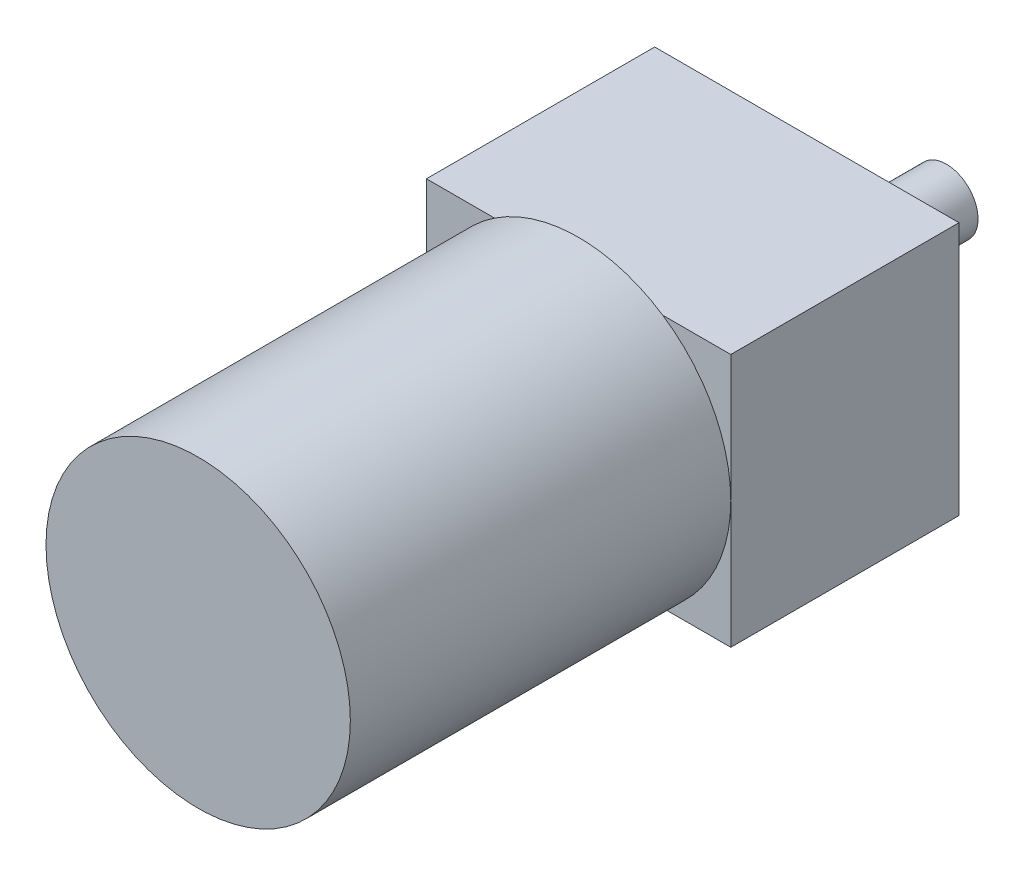
ISO-10303-21;
HEADER;
FILE_DESCRIPTION(('STEP AP214'),'2;1');
FILE_NAME('part.step','',(''),(''),'','','');
FILE_SCHEMA(('AUTOMOTIVE_DESIGN { 1 0 10303 214 1 1 1 1 }'));
ENDSEC;
DATA;
#1=APPLICATION_CONTEXT('core data for automotive mechanical design processes');
#2=APPLICATION_PROTOCOL_DEFINITION('international standard','automotive_design',2000,#1);
#3=PRODUCT_CONTEXT('',#1,'mechanical');
#4=PRODUCT('Part','Part','',(#3));
#5=PRODUCT_RELATED_PRODUCT_CATEGORY('part','',(#4));
#6=PRODUCT_DEFINITION_FORMATION('','',#4);
#7=PRODUCT_DEFINITION_CONTEXT('part definition',#1,'design');
#8=PRODUCT_DEFINITION('design','',#6,#7);
#9=PRODUCT_DEFINITION_SHAPE('','',#8);
#10=(LENGTH_UNIT() NAMED_UNIT(*) SI_UNIT(.MILLI.,.METRE.));
#11=(NAMED_UNIT(*) PLANE_ANGLE_UNIT() SI_UNIT($,.RADIAN.));
#12=(NAMED_UNIT(*) SI_UNIT($,.STERADIAN.) SOLID_ANGLE_UNIT());
#13=UNCERTAINTY_MEASURE_WITH_UNIT(LENGTH_MEASURE(1.E-05),#10,'distance_accuracy_value','');
#14=(GEOMETRIC_REPRESENTATION_CONTEXT(3) GLOBAL_UNCERTAINTY_ASSIGNED_CONTEXT((#13)) GLOBAL_UNIT_ASSIGNED_CONTEXT((#10,
#11,#12)) REPRESENTATION_CONTEXT('',''));
#15=CARTESIAN_POINT('',(0.,0.,0.));
#16=DIRECTION('',(0.,0.,1.));
#17=DIRECTION('',(1.,0.,0.));
#18=AXIS2_PLACEMENT_3D('',#15,#16,#17);
#19=CARTESIAN_POINT('',(0.,0.,9.));
#20=DIRECTION('',(0.,0.,1.));
#21=DIRECTION('',(1.,0.,0.));
#22=AXIS2_PLACEMENT_3D('',#19,#20,#21);
#23=PLANE('',#22);
#24=CARTESIAN_POINT('',(6.,-5.,9.));
#25=DIRECTION('',(0.,0.,1.));
#26=DIRECTION('',(1.,0.,0.));
#27=AXIS2_PLACEMENT_3D('',#24,#25,#26);
#28=CIRCLE('',#27,6.);
#29=CARTESIAN_POINT('',(2.6833752096446,0.,9.));
#30=VERTEX_POINT('',#29);
#31=CARTESIAN_POINT('',(0.,-5.,9.));
#32=VERTEX_POINT('',#31);
#33=EDGE_CURVE('E63',#30,#32,#28,.T.);
#34=ORIENTED_EDGE('',*,*,#33,.F.);
#35=DIRECTION('',(-1.,0.,0.));
#36=VECTOR('',#35,1.);
#37=CARTESIAN_POINT('',(0.,0.,9.));
#38=LINE('',#37,#36);
#39=CARTESIAN_POINT('',(0.,0.,9.));
#40=VERTEX_POINT('',#39);
#41=EDGE_CURVE('E119',#30,#40,#38,.T.);
#42=ORIENTED_EDGE('',*,*,#41,.T.);
#43=DIRECTION('',(0.,-1.,0.));
#44=VECTOR('',#43,1.);
#45=CARTESIAN_POINT('',(0.,0.,9.));
#46=LINE('',#45,#44);
#47=EDGE_CURVE('E155',#40,#32,#46,.T.);
#48=ORIENTED_EDGE('',*,*,#47,.T.);
#49=EDGE_LOOP('',(#34,#42,#48));
#50=FACE_BOUND('',#49,.T.);
#51=ADVANCED_FACE('F45',(#50),#23,.T.);
#52=CARTESIAN_POINT('',(2.6833752096446,-10.,9.));
#53=VERTEX_POINT('',#52);
#54=EDGE_CURVE('E147',#32,#53,#28,.T.);
#55=ORIENTED_EDGE('',*,*,#54,.F.);
#56=CARTESIAN_POINT('',(0.,-10.,9.));
#57=VERTEX_POINT('',#56);
#58=EDGE_CURVE('E158',#32,#57,#46,.T.);
#59=ORIENTED_EDGE('',*,*,#58,.T.);
#60=DIRECTION('',(1.,0.,0.));
#61=VECTOR('',#60,1.);
#62=CARTESIAN_POINT('',(0.,-10.,9.));
#63=LINE('',#62,#61);
#64=EDGE_CURVE('E129',#57,#53,#63,.T.);
#65=ORIENTED_EDGE('',*,*,#64,.T.);
#66=EDGE_LOOP('',(#55,#59,#65));
#67=FACE_BOUND('',#66,.T.);
#68=ADVANCED_FACE('F232',(#67),#23,.T.);
#69=CARTESIAN_POINT('',(12.,-5.,9.));
#70=VERTEX_POINT('',#69);
#71=CARTESIAN_POINT('',(9.3166247903554,0.,9.));
#72=VERTEX_POINT('',#71);
#73=EDGE_CURVE('E131',#70,#72,#28,.T.);
#74=ORIENTED_EDGE('',*,*,#73,.F.);
#75=DIRECTION('',(0.,1.,0.));
#76=VECTOR('',#75,1.);
#77=CARTESIAN_POINT('',(12.,0.,9.));
#78=LINE('',#77,#76);
#79=CARTESIAN_POINT('',(12.,0.,9.));
#80=VERTEX_POINT('',#79);
#81=EDGE_CURVE('E120',#70,#80,#78,.T.);
#82=ORIENTED_EDGE('',*,*,#81,.T.);
#83=EDGE_CURVE('E133',#80,#72,#38,.T.);
#84=ORIENTED_EDGE('',*,*,#83,.T.);
#85=EDGE_LOOP('',(#74,#82,#84));
#86=FACE_BOUND('',#85,.T.);
#87=ADVANCED_FACE('F132',(#86),#23,.T.);
#88=CARTESIAN_POINT('',(0.,0.,9.));
#89=DIRECTION('',(1.,0.,0.));
#90=DIRECTION('',(0.,1.,0.));
#91=AXIS2_PLACEMENT_3D('',#88,#89,#90);
#92=PLANE('',#91);
#93=DIRECTION('',(0.,-1.,0.));
#94=VECTOR('',#93,1.);
#95=CARTESIAN_POINT('',(0.,0.,0.));
#96=LINE('',#95,#94);
#97=CARTESIAN_POINT('',(0.,0.,0.));
#98=VERTEX_POINT('',#97);
#99=CARTESIAN_POINT('',(0.,-10.,0.));
#100=VERTEX_POINT('',#99);
#101=EDGE_CURVE('E166',#98,#100,#96,.T.);
#102=ORIENTED_EDGE('',*,*,#101,.T.);
#103=DIRECTION('',(0.,0.,-1.));
#104=VECTOR('',#103,1.);
#105=CARTESIAN_POINT('',(0.,-10.,9.));
#106=LINE('',#105,#104);
#107=EDGE_CURVE('E49',#57,#100,#106,.T.);
#108=ORIENTED_EDGE('',*,*,#107,.F.);
#109=ORIENTED_EDGE('',*,*,#58,.F.);
#110=ORIENTED_EDGE('',*,*,#47,.F.);
#111=DIRECTION('',(0.,0.,-1.));
#112=VECTOR('',#111,1.);
#113=CARTESIAN_POINT('',(0.,0.,9.));
#114=LINE('',#113,#112);
#115=EDGE_CURVE('E165',#40,#98,#114,.T.);
#116=ORIENTED_EDGE('',*,*,#115,.T.);
#117=EDGE_LOOP('',(#102,#108,#109,#110,#116));
#118=FACE_BOUND('',#117,.T.);
#119=ADVANCED_FACE('F47',(#118),#92,.F.);
#120=CARTESIAN_POINT('',(0.,-10.,9.));
#121=DIRECTION('',(0.,1.,0.));
#122=DIRECTION('',(0.,0.,1.));
#123=AXIS2_PLACEMENT_3D('',#120,#121,#122);
#124=PLANE('',#123);
#125=DIRECTION('',(1.,0.,0.));
#126=VECTOR('',#125,1.);
#127=CARTESIAN_POINT('',(0.,-10.,0.));
#128=LINE('',#127,#126);
#129=CARTESIAN_POINT('',(12.,-10.,0.));
#130=VERTEX_POINT('',#129);
#131=EDGE_CURVE('E170',#100,#130,#128,.T.);
#132=ORIENTED_EDGE('',*,*,#131,.T.);
#133=DIRECTION('',(0.,0.,-1.));
#134=VECTOR('',#133,1.);
#135=CARTESIAN_POINT('',(12.,-10.,9.));
#136=LINE('',#135,#134);
#137=CARTESIAN_POINT('',(12.,-10.,9.));
#138=VERTEX_POINT('',#137);
#139=EDGE_CURVE('E151',#138,#130,#136,.T.);
#140=ORIENTED_EDGE('',*,*,#139,.F.);
#141=CARTESIAN_POINT('',(9.3166247903554,-10.,9.));
#142=VERTEX_POINT('',#141);
#143=EDGE_CURVE('E114',#142,#138,#63,.T.);
#144=ORIENTED_EDGE('',*,*,#143,.F.);
#145=EDGE_CURVE('E161',#53,#142,#63,.T.);
#146=ORIENTED_EDGE('',*,*,#145,.F.);
#147=ORIENTED_EDGE('',*,*,#64,.F.);
#148=ORIENTED_EDGE('',*,*,#107,.T.);
#149=EDGE_LOOP('',(#132,#140,#144,#146,#147,#148));
#150=FACE_BOUND('',#149,.T.);
#151=ADVANCED_FACE('F253',(#150),#124,.F.);
#152=CARTESIAN_POINT('',(12.,0.,9.));
#153=DIRECTION('',(-1.,0.,0.));
#154=DIRECTION('',(0.,0.,1.));
#155=AXIS2_PLACEMENT_3D('',#152,#153,#154);
#156=PLANE('',#155);
#157=DIRECTION('',(0.,1.,0.));
#158=VECTOR('',#157,1.);
#159=CARTESIAN_POINT('',(12.,0.,0.));
#160=LINE('',#159,#158);
#161=CARTESIAN_POINT('',(12.,0.,0.));
#162=VERTEX_POINT('',#161);
#163=EDGE_CURVE('E173',#130,#162,#160,.T.);
#164=ORIENTED_EDGE('',*,*,#163,.T.);
#165=DIRECTION('',(0.,0.,-1.));
#166=VECTOR('',#165,1.);
#167=CARTESIAN_POINT('',(12.,0.,9.));
#168=LINE('',#167,#166);
#169=EDGE_CURVE('E126',#80,#162,#168,.T.);
#170=ORIENTED_EDGE('',*,*,#169,.F.);
#171=ORIENTED_EDGE('',*,*,#81,.F.);
#172=EDGE_CURVE('E108',#138,#70,#78,.T.);
#173=ORIENTED_EDGE('',*,*,#172,.F.);
#174=ORIENTED_EDGE('',*,*,#139,.T.);
#175=EDGE_LOOP('',(#164,#170,#171,#173,#174));
#176=FACE_BOUND('',#175,.T.);
#177=ADVANCED_FACE('F124',(#176),#156,.F.);
#178=CARTESIAN_POINT('',(0.,0.,9.));
#179=DIRECTION('',(0.,-1.,0.));
#180=DIRECTION('',(0.,0.,-1.));
#181=AXIS2_PLACEMENT_3D('',#178,#179,#180);
#182=PLANE('',#181);
#183=DIRECTION('',(-1.,0.,0.));
#184=VECTOR('',#183,1.);
#185=CARTESIAN_POINT('',(0.,0.,0.));
#186=LINE('',#185,#184);
#187=EDGE_CURVE('E176',#162,#98,#186,.T.);
#188=ORIENTED_EDGE('',*,*,#187,.T.);
#189=ORIENTED_EDGE('',*,*,#115,.F.);
#190=ORIENTED_EDGE('',*,*,#41,.F.);
#191=EDGE_CURVE('E70',#72,#30,#38,.T.);
#192=ORIENTED_EDGE('',*,*,#191,.F.);
#193=ORIENTED_EDGE('',*,*,#83,.F.);
#194=ORIENTED_EDGE('',*,*,#169,.T.);
#195=EDGE_LOOP('',(#188,#189,#190,#192,#193,#194));
#196=FACE_BOUND('',#195,.T.);
#197=ADVANCED_FACE('F191',(#196),#182,.F.);
#198=EDGE_CURVE('E112',#142,#70,#28,.T.);
#199=ORIENTED_EDGE('',*,*,#198,.F.);
#200=ORIENTED_EDGE('',*,*,#143,.T.);
#201=ORIENTED_EDGE('',*,*,#172,.T.);
#202=EDGE_LOOP('',(#199,#200,#201));
#203=FACE_BOUND('',#202,.T.);
#204=ADVANCED_FACE('F110',(#203),#23,.T.);
#205=CARTESIAN_POINT('',(0.,0.,0.));
#206=DIRECTION('',(0.,0.,1.));
#207=DIRECTION('',(1.,0.,0.));
#208=AXIS2_PLACEMENT_3D('',#205,#206,#207);
#209=PLANE('',#208);
#210=CARTESIAN_POINT('',(6.,-5.,0.));
#211=DIRECTION('',(0.,0.,-1.));
#212=DIRECTION('',(-1.,0.,0.));
#213=AXIS2_PLACEMENT_3D('',#210,#211,#212);
#214=CIRCLE('',#213,2.);
#215=CARTESIAN_POINT('',(4.,-5.,0.));
#216=VERTEX_POINT('',#215);
#217=EDGE_CURVE('E55',#216,#216,#214,.T.);
#218=ORIENTED_EDGE('',*,*,#217,.F.);
#219=EDGE_LOOP('',(#218));
#220=FACE_BOUND('',#219,.T.);
#221=ORIENTED_EDGE('',*,*,#101,.F.);
#222=ORIENTED_EDGE('',*,*,#187,.F.);
#223=ORIENTED_EDGE('',*,*,#163,.F.);
#224=ORIENTED_EDGE('',*,*,#131,.F.);
#225=EDGE_LOOP('',(#221,#222,#223,#224));
#226=FACE_BOUND('',#225,.T.);
#227=ADVANCED_FACE('F189',(#220,#226),#209,.F.);
#228=CARTESIAN_POINT('',(6.,-5.,9.));
#229=DIRECTION('',(0.,0.,1.));
#230=DIRECTION('',(1.,0.,0.));
#231=AXIS2_PLACEMENT_3D('',#228,#229,#230);
#232=PLANE('',#231);
#233=EDGE_CURVE('E141',#53,#142,#28,.T.);
#234=ORIENTED_EDGE('',*,*,#233,.F.);
#235=ORIENTED_EDGE('',*,*,#145,.T.);
#236=EDGE_LOOP('',(#234,#235));
#237=FACE_BOUND('',#236,.T.);
#238=ADVANCED_FACE('F246',(#237),#232,.F.);
#239=EDGE_CURVE('E139',#72,#30,#28,.T.);
#240=ORIENTED_EDGE('',*,*,#239,.F.);
#241=ORIENTED_EDGE('',*,*,#191,.T.);
#242=EDGE_LOOP('',(#240,#241));
#243=FACE_BOUND('',#242,.T.);
#244=ADVANCED_FACE('F273',(#243),#232,.F.);
#245=CARTESIAN_POINT('',(6.,-5.,24.));
#246=DIRECTION('',(0.,0.,-1.));
#247=DIRECTION('',(-1.,0.,0.));
#248=AXIS2_PLACEMENT_3D('',#245,#246,#247);
#249=CYLINDRICAL_SURFACE('',#248,6.);
#250=CARTESIAN_POINT('',(6.,-5.,24.));
#251=DIRECTION('',(0.,0.,1.));
#252=DIRECTION('',(1.,0.,0.));
#253=AXIS2_PLACEMENT_3D('',#250,#251,#252);
#254=CIRCLE('',#253,6.);
#255=CARTESIAN_POINT('',(12.,-5.,24.));
#256=VERTEX_POINT('',#255);
#257=EDGE_CURVE('E138',#256,#256,#254,.T.);
#258=ORIENTED_EDGE('',*,*,#257,.F.);
#259=EDGE_LOOP('',(#258));
#260=FACE_BOUND('',#259,.T.);
#261=ORIENTED_EDGE('',*,*,#73,.T.);
#262=ORIENTED_EDGE('',*,*,#239,.T.);
#263=ORIENTED_EDGE('',*,*,#33,.T.);
#264=ORIENTED_EDGE('',*,*,#54,.T.);
#265=ORIENTED_EDGE('',*,*,#233,.T.);
#266=ORIENTED_EDGE('',*,*,#198,.T.);
#267=EDGE_LOOP('',(#261,#262,#263,#264,#265,#266));
#268=FACE_BOUND('',#267,.T.);
#269=ADVANCED_FACE('F143',(#260,#268),#249,.T.);
#270=CARTESIAN_POINT('',(6.,-5.,24.));
#271=DIRECTION('',(0.,0.,1.));
#272=DIRECTION('',(1.,0.,0.));
#273=AXIS2_PLACEMENT_3D('',#270,#271,#272);
#274=PLANE('',#273);
#275=ORIENTED_EDGE('',*,*,#257,.T.);
#276=EDGE_LOOP('',(#275));
#277=FACE_BOUND('',#276,.T.);
#278=ADVANCED_FACE('F228',(#277),#274,.T.);
#279=CARTESIAN_POINT('',(6.,-5.,-1.));
#280=DIRECTION('',(0.,0.,1.));
#281=DIRECTION('',(1.,0.,0.));
#282=AXIS2_PLACEMENT_3D('',#279,#280,#281);
#283=CYLINDRICAL_SURFACE('',#282,2.);
#284=CARTESIAN_POINT('',(6.,-5.,-1.));
#285=DIRECTION('',(0.,0.,-1.));
#286=DIRECTION('',(-1.,0.,0.));
#287=AXIS2_PLACEMENT_3D('',#284,#285,#286);
#288=CIRCLE('',#287,2.);
#289=CARTESIAN_POINT('',(4.,-5.,-1.));
#290=VERTEX_POINT('',#289);
#291=EDGE_CURVE('E201',#290,#290,#288,.T.);
#292=ORIENTED_EDGE('',*,*,#291,.F.);
#293=EDGE_LOOP('',(#292));
#294=FACE_BOUND('',#293,.T.);
#295=ORIENTED_EDGE('',*,*,#217,.T.);
#296=EDGE_LOOP('',(#295));
#297=FACE_BOUND('',#296,.T.);
#298=ADVANCED_FACE('F223',(#294,#297),#283,.T.);
#299=CARTESIAN_POINT('',(6.,-5.,-1.));
#300=DIRECTION('',(0.,0.,-1.));
#301=DIRECTION('',(-1.,0.,0.));
#302=AXIS2_PLACEMENT_3D('',#299,#300,#301);
#303=PLANE('',#302);
#304=CARTESIAN_POINT('',(6.,-5.,-1.));
#305=DIRECTION('',(0.,0.,-1.));
#306=DIRECTION('',(-1.,0.,0.));
#307=AXIS2_PLACEMENT_3D('',#304,#305,#306);
#308=CIRCLE('',#307,1.25);
#309=CARTESIAN_POINT('',(4.75,-5.,-1.));
#310=VERTEX_POINT('',#309);
#311=EDGE_CURVE('E11',#310,#310,#308,.T.);
#312=ORIENTED_EDGE('',*,*,#311,.F.);
#313=EDGE_LOOP('',(#312));
#314=FACE_BOUND('',#313,.T.);
#315=ORIENTED_EDGE('',*,*,#291,.T.);
#316=EDGE_LOOP('',(#315));
#317=FACE_BOUND('',#316,.T.);
#318=ADVANCED_FACE('F218',(#314,#317),#303,.T.);
#319=CARTESIAN_POINT('',(6.,-5.,-5.5));
#320=DIRECTION('',(0.,0.,1.));
#321=DIRECTION('',(1.,0.,0.));
#322=AXIS2_PLACEMENT_3D('',#319,#320,#321);
#323=CYLINDRICAL_SURFACE('',#322,1.25);
#324=CARTESIAN_POINT('',(6.,-5.,-5.5));
#325=DIRECTION('',(0.,0.,-1.));
#326=DIRECTION('',(-1.,0.,0.));
#327=AXIS2_PLACEMENT_3D('',#324,#325,#326);
#328=CIRCLE('',#327,1.25);
#329=CARTESIAN_POINT('',(4.75,-5.,-5.5));
#330=VERTEX_POINT('',#329);
#331=EDGE_CURVE('E204',#330,#330,#328,.T.);
#332=ORIENTED_EDGE('',*,*,#331,.F.);
#333=EDGE_LOOP('',(#332));
#334=FACE_BOUND('',#333,.T.);
#335=ORIENTED_EDGE('',*,*,#311,.T.);
#336=EDGE_LOOP('',(#335));
#337=FACE_BOUND('',#336,.T.);
#338=ADVANCED_FACE('F215',(#334,#337),#323,.T.);
#339=CARTESIAN_POINT('',(6.,-5.,-5.5));
#340=DIRECTION('',(0.,0.,-1.));
#341=DIRECTION('',(-1.,0.,0.));
#342=AXIS2_PLACEMENT_3D('',#339,#340,#341);
#343=PLANE('',#342);
#344=ORIENTED_EDGE('',*,*,#331,.T.);
#345=EDGE_LOOP('',(#344));
#346=FACE_BOUND('',#345,.T.);
#347=ADVANCED_FACE('F213',(#346),#343,.T.);
#348=CLOSED_SHELL('',(#51,#68,#87,#119,#151,#177,#197,#204,#227,#238,#244,#269,#278,#298,#318,
#338,#347));
#349=MANIFOLD_SOLID_BREP('B2',#348);
#350=ADVANCED_BREP_SHAPE_REPRESENTATION('',(#18,#349),#14);
#351=SHAPE_DEFINITION_REPRESENTATION(#9,#350);
ENDSEC;
END-ISO-10303-21;
